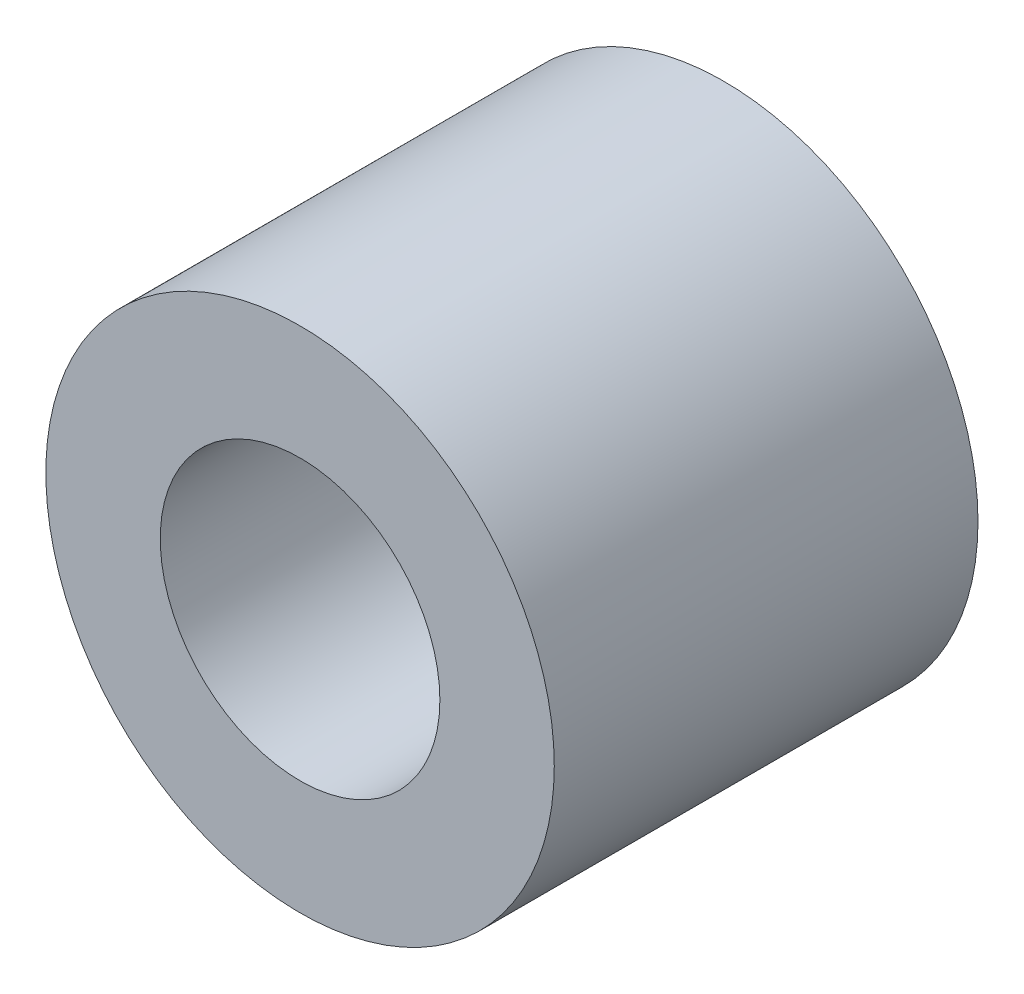
ISO-10303-21;
HEADER;
FILE_DESCRIPTION(('STEP AP214'),'2;1');
FILE_NAME('part.step','',(''),(''),'','','');
FILE_SCHEMA(('AUTOMOTIVE_DESIGN { 1 0 10303 214 1 1 1 1 }'));
ENDSEC;
DATA;
#1=APPLICATION_CONTEXT('core data for automotive mechanical design processes');
#2=APPLICATION_PROTOCOL_DEFINITION('international standard','automotive_design',2000,#1);
#3=PRODUCT_CONTEXT('',#1,'mechanical');
#4=PRODUCT('Part','Part','',(#3));
#5=PRODUCT_RELATED_PRODUCT_CATEGORY('part','',(#4));
#6=PRODUCT_DEFINITION_FORMATION('','',#4);
#7=PRODUCT_DEFINITION_CONTEXT('part definition',#1,'design');
#8=PRODUCT_DEFINITION('design','',#6,#7);
#9=PRODUCT_DEFINITION_SHAPE('','',#8);
#10=(LENGTH_UNIT() NAMED_UNIT(*) SI_UNIT(.MILLI.,.METRE.));
#11=(NAMED_UNIT(*) PLANE_ANGLE_UNIT() SI_UNIT($,.RADIAN.));
#12=(NAMED_UNIT(*) SI_UNIT($,.STERADIAN.) SOLID_ANGLE_UNIT());
#13=UNCERTAINTY_MEASURE_WITH_UNIT(LENGTH_MEASURE(1.E-05),#10,'distance_accuracy_value','');
#14=(GEOMETRIC_REPRESENTATION_CONTEXT(3) GLOBAL_UNCERTAINTY_ASSIGNED_CONTEXT((#13)) GLOBAL_UNIT_ASSIGNED_CONTEXT((#10,
#11,#12)) REPRESENTATION_CONTEXT('',''));
#15=CARTESIAN_POINT('',(0.,0.,0.));
#16=DIRECTION('',(0.,0.,1.));
#17=DIRECTION('',(1.,0.,0.));
#18=AXIS2_PLACEMENT_3D('',#15,#16,#17);
#19=CARTESIAN_POINT('',(0.,0.,7.9375));
#20=DIRECTION('',(0.,0.,1.));
#21=DIRECTION('',(1.,0.,0.));
#22=AXIS2_PLACEMENT_3D('',#19,#20,#21);
#23=PLANE('',#22);
#24=CARTESIAN_POINT('',(0.,0.,7.9375));
#25=DIRECTION('',(0.,0.,1.));
#26=DIRECTION('',(1.,0.,0.));
#27=AXIS2_PLACEMENT_3D('',#24,#25,#26);
#28=CIRCLE('',#27,9.525);
#29=CARTESIAN_POINT('',(9.525,0.,7.9375));
#30=VERTEX_POINT('',#29);
#31=EDGE_CURVE('E10',#30,#30,#28,.T.);
#32=ORIENTED_EDGE('',*,*,#31,.T.);
#33=EDGE_LOOP('',(#32));
#34=FACE_BOUND('',#33,.T.);
#35=CARTESIAN_POINT('',(0.,0.,7.9375));
#36=DIRECTION('',(0.,0.,1.));
#37=DIRECTION('',(1.,0.,0.));
#38=AXIS2_PLACEMENT_3D('',#35,#36,#37);
#39=CIRCLE('',#38,5.23875);
#40=CARTESIAN_POINT('',(5.23875,0.,7.9375));
#41=VERTEX_POINT('',#40);
#42=EDGE_CURVE('E46',#41,#41,#39,.T.);
#43=ORIENTED_EDGE('',*,*,#42,.F.);
#44=EDGE_LOOP('',(#43));
#45=FACE_BOUND('',#44,.T.);
#46=ADVANCED_FACE('F35',(#34,#45),#23,.T.);
#47=CARTESIAN_POINT('',(0.,0.,-7.9375));
#48=DIRECTION('',(0.,0.,1.));
#49=DIRECTION('',(1.,0.,0.));
#50=AXIS2_PLACEMENT_3D('',#47,#48,#49);
#51=PLANE('',#50);
#52=CARTESIAN_POINT('',(0.,0.,-7.9375));
#53=DIRECTION('',(0.,0.,1.));
#54=DIRECTION('',(1.,0.,0.));
#55=AXIS2_PLACEMENT_3D('',#52,#53,#54);
#56=CIRCLE('',#55,9.525);
#57=CARTESIAN_POINT('',(9.525,0.,-7.9375));
#58=VERTEX_POINT('',#57);
#59=EDGE_CURVE('E39',#58,#58,#56,.T.);
#60=ORIENTED_EDGE('',*,*,#59,.F.);
#61=EDGE_LOOP('',(#60));
#62=FACE_BOUND('',#61,.T.);
#63=CARTESIAN_POINT('',(0.,0.,-7.9375));
#64=DIRECTION('',(0.,0.,1.));
#65=DIRECTION('',(1.,0.,0.));
#66=AXIS2_PLACEMENT_3D('',#63,#64,#65);
#67=CIRCLE('',#66,5.23875);
#68=CARTESIAN_POINT('',(5.23875,0.,-7.9375));
#69=VERTEX_POINT('',#68);
#70=EDGE_CURVE('E48',#69,#69,#67,.T.);
#71=ORIENTED_EDGE('',*,*,#70,.T.);
#72=EDGE_LOOP('',(#71));
#73=FACE_BOUND('',#72,.T.);
#74=ADVANCED_FACE('F58',(#62,#73),#51,.F.);
#75=CARTESIAN_POINT('',(0.,0.,7.9375));
#76=DIRECTION('',(0.,0.,-1.));
#77=DIRECTION('',(-1.,0.,0.));
#78=AXIS2_PLACEMENT_3D('',#75,#76,#77);
#79=CYLINDRICAL_SURFACE('',#78,9.525);
#80=ORIENTED_EDGE('',*,*,#31,.F.);
#81=EDGE_LOOP('',(#80));
#82=FACE_BOUND('',#81,.T.);
#83=ORIENTED_EDGE('',*,*,#59,.T.);
#84=EDGE_LOOP('',(#83));
#85=FACE_BOUND('',#84,.T.);
#86=ADVANCED_FACE('F37',(#82,#85),#79,.T.);
#87=CARTESIAN_POINT('',(0.,0.,7.9375));
#88=DIRECTION('',(0.,0.,-1.));
#89=DIRECTION('',(-1.,0.,0.));
#90=AXIS2_PLACEMENT_3D('',#87,#88,#89);
#91=CYLINDRICAL_SURFACE('',#90,5.23875);
#92=ORIENTED_EDGE('',*,*,#42,.T.);
#93=EDGE_LOOP('',(#92));
#94=FACE_BOUND('',#93,.T.);
#95=ORIENTED_EDGE('',*,*,#70,.F.);
#96=EDGE_LOOP('',(#95));
#97=FACE_BOUND('',#96,.T.);
#98=ADVANCED_FACE('F54',(#94,#97),#91,.F.);
#99=CLOSED_SHELL('',(#46,#74,#86,#98));
#100=MANIFOLD_SOLID_BREP('B2',#99);
#101=ADVANCED_BREP_SHAPE_REPRESENTATION('',(#18,#100),#14);
#102=SHAPE_DEFINITION_REPRESENTATION(#9,#101);
ENDSEC;
END-ISO-10303-21;
